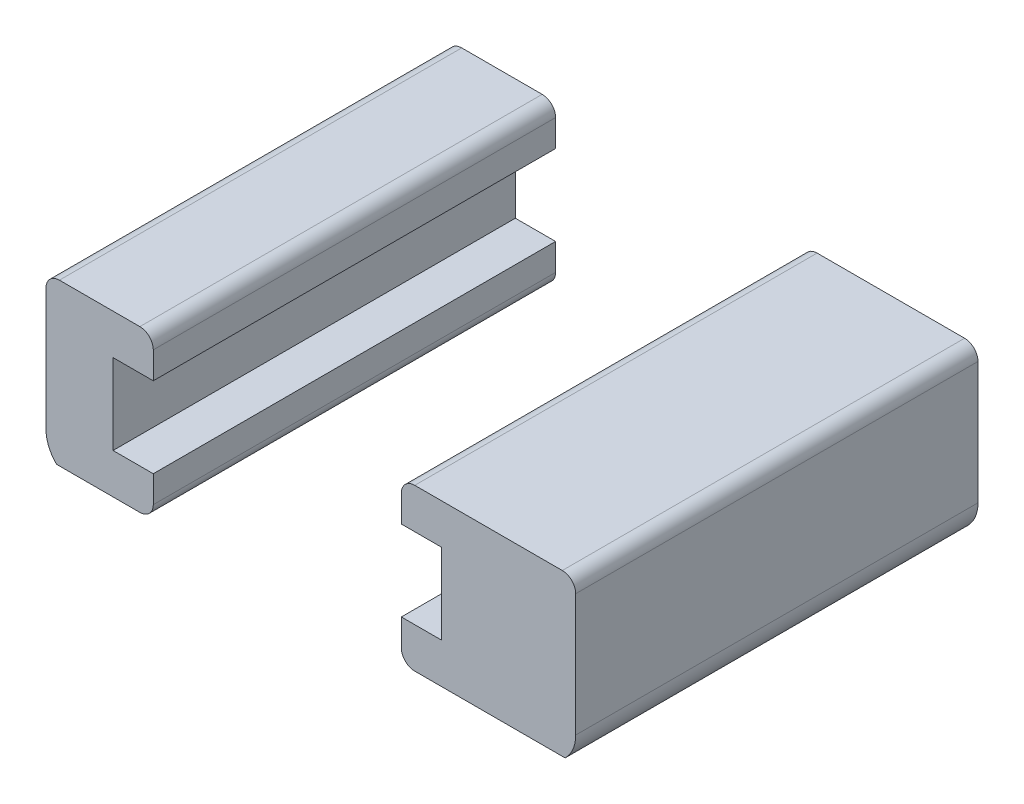
ISO-10303-21;
HEADER;
FILE_DESCRIPTION(('STEP AP214'),'2;1');
FILE_NAME('part.step','',(''),(''),'','','');
FILE_SCHEMA(('AUTOMOTIVE_DESIGN { 1 0 10303 214 1 1 1 1 }'));
ENDSEC;
DATA;
#1=APPLICATION_CONTEXT('core data for automotive mechanical design processes');
#2=APPLICATION_PROTOCOL_DEFINITION('international standard','automotive_design',2000,#1);
#3=PRODUCT_CONTEXT('',#1,'mechanical');
#4=PRODUCT('Part','Part','',(#3));
#5=PRODUCT_RELATED_PRODUCT_CATEGORY('part','',(#4));
#6=PRODUCT_DEFINITION_FORMATION('','',#4);
#7=PRODUCT_DEFINITION_CONTEXT('part definition',#1,'design');
#8=PRODUCT_DEFINITION('design','',#6,#7);
#9=PRODUCT_DEFINITION_SHAPE('','',#8);
#10=(LENGTH_UNIT() NAMED_UNIT(*) SI_UNIT(.MILLI.,.METRE.));
#11=(NAMED_UNIT(*) PLANE_ANGLE_UNIT() SI_UNIT($,.RADIAN.));
#12=(NAMED_UNIT(*) SI_UNIT($,.STERADIAN.) SOLID_ANGLE_UNIT());
#13=UNCERTAINTY_MEASURE_WITH_UNIT(LENGTH_MEASURE(1.E-05),#10,'distance_accuracy_value','');
#14=(GEOMETRIC_REPRESENTATION_CONTEXT(3) GLOBAL_UNCERTAINTY_ASSIGNED_CONTEXT((#13)) GLOBAL_UNIT_ASSIGNED_CONTEXT((#10,
#11,#12)) REPRESENTATION_CONTEXT('',''));
#15=CARTESIAN_POINT('',(0.,0.,0.));
#16=DIRECTION('',(0.,0.,1.));
#17=DIRECTION('',(1.,0.,0.));
#18=AXIS2_PLACEMENT_3D('',#15,#16,#17);
#19=CARTESIAN_POINT('',(-34.5,18.,30.));
#20=DIRECTION('',(1.,0.,0.));
#21=DIRECTION('',(0.,0.,-1.));
#22=AXIS2_PLACEMENT_3D('',#19,#20,#21);
#23=PLANE('',#22);
#24=DIRECTION('',(0.,0.,-1.));
#25=VECTOR('',#24,1.);
#26=CARTESIAN_POINT('',(-34.5000000000004,-2.25620993681813,30.));
#27=LINE('',#26,#25);
#28=CARTESIAN_POINT('',(-34.5000000000004,-2.25620993681813,30.));
#29=VERTEX_POINT('',#28);
#30=CARTESIAN_POINT('',(-34.5000000000003,-2.25620993681814,-30.));
#31=VERTEX_POINT('',#30);
#32=EDGE_CURVE('E64',#29,#31,#27,.T.);
#33=ORIENTED_EDGE('',*,*,#32,.F.);
#34=DIRECTION('',(0.,-1.,0.));
#35=VECTOR('',#34,1.);
#36=CARTESIAN_POINT('',(-34.5,18.,30.));
#37=LINE('',#36,#35);
#38=CARTESIAN_POINT('',(-34.5,16.,30.));
#39=VERTEX_POINT('',#38);
#40=EDGE_CURVE('E144',#39,#29,#37,.T.);
#41=ORIENTED_EDGE('',*,*,#40,.F.);
#42=DIRECTION('',(0.,0.,-1.));
#43=VECTOR('',#42,1.);
#44=CARTESIAN_POINT('',(-34.5,16.,30.));
#45=LINE('',#44,#43);
#46=CARTESIAN_POINT('',(-34.5,16.,-30.));
#47=VERTEX_POINT('',#46);
#48=EDGE_CURVE('E172',#39,#47,#45,.T.);
#49=ORIENTED_EDGE('',*,*,#48,.T.);
#50=DIRECTION('',(0.,-1.,0.));
#51=VECTOR('',#50,1.);
#52=CARTESIAN_POINT('',(-34.5,18.,-30.));
#53=LINE('',#52,#51);
#54=EDGE_CURVE('E147',#47,#31,#53,.T.);
#55=ORIENTED_EDGE('',*,*,#54,.T.);
#56=EDGE_LOOP('',(#33,#41,#49,#55));
#57=FACE_BOUND('',#56,.T.);
#58=ADVANCED_FACE('F49',(#57),#23,.F.);
#59=CARTESIAN_POINT('',(-24.5,0.,30.));
#60=DIRECTION('',(0.,-1.,0.));
#61=DIRECTION('',(1.,0.,0.));
#62=AXIS2_PLACEMENT_3D('',#59,#60,#61);
#63=PLANE('',#62);
#64=DIRECTION('',(-1.,0.,0.));
#65=VECTOR('',#64,1.);
#66=CARTESIAN_POINT('',(-24.5,0.,-30.));
#67=LINE('',#66,#65);
#68=CARTESIAN_POINT('',(-18.5,0.,-30.));
#69=VERTEX_POINT('',#68);
#70=CARTESIAN_POINT('',(-24.5,0.,-30.));
#71=VERTEX_POINT('',#70);
#72=EDGE_CURVE('E175',#69,#71,#67,.T.);
#73=ORIENTED_EDGE('',*,*,#72,.T.);
#74=DIRECTION('',(0.,0.,-1.));
#75=VECTOR('',#74,1.);
#76=CARTESIAN_POINT('',(-24.5,0.,30.));
#77=LINE('',#76,#75);
#78=CARTESIAN_POINT('',(-24.5,0.,30.));
#79=VERTEX_POINT('',#78);
#80=EDGE_CURVE('E138',#79,#71,#77,.T.);
#81=ORIENTED_EDGE('',*,*,#80,.F.);
#82=DIRECTION('',(-1.,0.,0.));
#83=VECTOR('',#82,1.);
#84=CARTESIAN_POINT('',(-24.5,0.,30.));
#85=LINE('',#84,#83);
#86=CARTESIAN_POINT('',(-18.5,0.,30.));
#87=VERTEX_POINT('',#86);
#88=EDGE_CURVE('E168',#87,#79,#85,.T.);
#89=ORIENTED_EDGE('',*,*,#88,.F.);
#90=DIRECTION('',(0.,0.,-1.));
#91=VECTOR('',#90,1.);
#92=CARTESIAN_POINT('',(-18.5,0.,30.));
#93=LINE('',#92,#91);
#94=EDGE_CURVE('E211',#87,#69,#93,.T.);
#95=ORIENTED_EDGE('',*,*,#94,.T.);
#96=EDGE_LOOP('',(#73,#81,#89,#95));
#97=FACE_BOUND('',#96,.T.);
#98=ADVANCED_FACE('F242',(#97),#63,.F.);
#99=CARTESIAN_POINT('',(-24.5,12.,30.));
#100=DIRECTION('',(-1.,0.,0.));
#101=DIRECTION('',(0.,-1.,0.));
#102=AXIS2_PLACEMENT_3D('',#99,#100,#101);
#103=PLANE('',#102);
#104=DIRECTION('',(0.,1.,0.));
#105=VECTOR('',#104,1.);
#106=CARTESIAN_POINT('',(-24.5,12.,-30.));
#107=LINE('',#106,#105);
#108=CARTESIAN_POINT('',(-24.5,12.,-30.));
#109=VERTEX_POINT('',#108);
#110=EDGE_CURVE('E218',#71,#109,#107,.T.);
#111=ORIENTED_EDGE('',*,*,#110,.T.);
#112=DIRECTION('',(0.,0.,-1.));
#113=VECTOR('',#112,1.);
#114=CARTESIAN_POINT('',(-24.5,12.,30.));
#115=LINE('',#114,#113);
#116=CARTESIAN_POINT('',(-24.5,12.,30.));
#117=VERTEX_POINT('',#116);
#118=EDGE_CURVE('E233',#117,#109,#115,.T.);
#119=ORIENTED_EDGE('',*,*,#118,.F.);
#120=DIRECTION('',(0.,1.,0.));
#121=VECTOR('',#120,1.);
#122=CARTESIAN_POINT('',(-24.5,12.,30.));
#123=LINE('',#122,#121);
#124=EDGE_CURVE('E166',#79,#117,#123,.T.);
#125=ORIENTED_EDGE('',*,*,#124,.F.);
#126=ORIENTED_EDGE('',*,*,#80,.T.);
#127=EDGE_LOOP('',(#111,#119,#125,#126));
#128=FACE_BOUND('',#127,.T.);
#129=ADVANCED_FACE('F245',(#128),#103,.F.);
#130=CARTESIAN_POINT('',(-24.5,12.,30.));
#131=DIRECTION('',(0.,1.,0.));
#132=DIRECTION('',(0.,0.,1.));
#133=AXIS2_PLACEMENT_3D('',#130,#131,#132);
#134=PLANE('',#133);
#135=DIRECTION('',(1.,0.,0.));
#136=VECTOR('',#135,1.);
#137=CARTESIAN_POINT('',(-24.5,12.,-30.));
#138=LINE('',#137,#136);
#139=CARTESIAN_POINT('',(-18.5,12.,-30.));
#140=VERTEX_POINT('',#139);
#141=EDGE_CURVE('E220',#109,#140,#138,.T.);
#142=ORIENTED_EDGE('',*,*,#141,.T.);
#143=DIRECTION('',(0.,0.,-1.));
#144=VECTOR('',#143,1.);
#145=CARTESIAN_POINT('',(-18.5,12.,30.));
#146=LINE('',#145,#144);
#147=CARTESIAN_POINT('',(-18.5,12.,30.));
#148=VERTEX_POINT('',#147);
#149=EDGE_CURVE('E213',#148,#140,#146,.T.);
#150=ORIENTED_EDGE('',*,*,#149,.F.);
#151=DIRECTION('',(1.,0.,0.));
#152=VECTOR('',#151,1.);
#153=CARTESIAN_POINT('',(-24.5,12.,30.));
#154=LINE('',#153,#152);
#155=EDGE_CURVE('E164',#117,#148,#154,.T.);
#156=ORIENTED_EDGE('',*,*,#155,.F.);
#157=ORIENTED_EDGE('',*,*,#118,.T.);
#158=EDGE_LOOP('',(#142,#150,#156,#157));
#159=FACE_BOUND('',#158,.T.);
#160=ADVANCED_FACE('F249',(#159),#134,.F.);
#161=CARTESIAN_POINT('',(-18.5,18.,30.));
#162=DIRECTION('',(-1.,0.,0.));
#163=DIRECTION('',(0.,0.,1.));
#164=AXIS2_PLACEMENT_3D('',#161,#162,#163);
#165=PLANE('',#164);
#166=DIRECTION('',(0.,1.,0.));
#167=VECTOR('',#166,1.);
#168=CARTESIAN_POINT('',(-18.5,18.,-30.));
#169=LINE('',#168,#167);
#170=CARTESIAN_POINT('',(-18.5,16.,-30.));
#171=VERTEX_POINT('',#170);
#172=EDGE_CURVE('E222',#140,#171,#169,.T.);
#173=ORIENTED_EDGE('',*,*,#172,.T.);
#174=DIRECTION('',(0.,0.,-1.));
#175=VECTOR('',#174,1.);
#176=CARTESIAN_POINT('',(-18.5,16.,30.));
#177=LINE('',#176,#175);
#178=CARTESIAN_POINT('',(-18.5,16.,30.));
#179=VERTEX_POINT('',#178);
#180=EDGE_CURVE('E192',#171,#179,#177,.F.);
#181=ORIENTED_EDGE('',*,*,#180,.T.);
#182=DIRECTION('',(0.,1.,0.));
#183=VECTOR('',#182,1.);
#184=CARTESIAN_POINT('',(-18.5,18.,30.));
#185=LINE('',#184,#183);
#186=EDGE_CURVE('E156',#148,#179,#185,.T.);
#187=ORIENTED_EDGE('',*,*,#186,.F.);
#188=ORIENTED_EDGE('',*,*,#149,.T.);
#189=EDGE_LOOP('',(#173,#181,#187,#188));
#190=FACE_BOUND('',#189,.T.);
#191=ADVANCED_FACE('F253',(#190),#165,.F.);
#192=CARTESIAN_POINT('',(-34.5,18.,30.));
#193=DIRECTION('',(0.,-1.,0.));
#194=DIRECTION('',(0.,0.,-1.));
#195=AXIS2_PLACEMENT_3D('',#192,#193,#194);
#196=PLANE('',#195);
#197=DIRECTION('',(-1.,0.,0.));
#198=VECTOR('',#197,1.);
#199=CARTESIAN_POINT('',(-34.5,18.,-30.));
#200=LINE('',#199,#198);
#201=CARTESIAN_POINT('',(-20.5,18.,-30.));
#202=VERTEX_POINT('',#201);
#203=CARTESIAN_POINT('',(-32.5,18.,-30.));
#204=VERTEX_POINT('',#203);
#205=EDGE_CURVE('E225',#202,#204,#200,.T.);
#206=ORIENTED_EDGE('',*,*,#205,.T.);
#207=DIRECTION('',(0.,0.,-1.));
#208=VECTOR('',#207,1.);
#209=CARTESIAN_POINT('',(-32.5,18.,30.));
#210=LINE('',#209,#208);
#211=CARTESIAN_POINT('',(-32.5,18.,30.));
#212=VERTEX_POINT('',#211);
#213=EDGE_CURVE('E185',#204,#212,#210,.F.);
#214=ORIENTED_EDGE('',*,*,#213,.T.);
#215=DIRECTION('',(-1.,0.,0.));
#216=VECTOR('',#215,1.);
#217=CARTESIAN_POINT('',(-34.5,18.,30.));
#218=LINE('',#217,#216);
#219=CARTESIAN_POINT('',(-20.5,18.,30.));
#220=VERTEX_POINT('',#219);
#221=EDGE_CURVE('E153',#220,#212,#218,.T.);
#222=ORIENTED_EDGE('',*,*,#221,.F.);
#223=DIRECTION('',(0.,0.,-1.));
#224=VECTOR('',#223,1.);
#225=CARTESIAN_POINT('',(-20.5,18.,30.));
#226=LINE('',#225,#224);
#227=EDGE_CURVE('E182',#220,#202,#226,.T.);
#228=ORIENTED_EDGE('',*,*,#227,.T.);
#229=EDGE_LOOP('',(#206,#214,#222,#228));
#230=FACE_BOUND('',#229,.T.);
#231=ADVANCED_FACE('F257',(#230),#196,.F.);
#232=CARTESIAN_POINT('',(-34.5,-6.,30.));
#233=DIRECTION('',(0.,1.,0.));
#234=DIRECTION('',(-1.,0.,0.));
#235=AXIS2_PLACEMENT_3D('',#232,#233,#234);
#236=PLANE('',#235);
#237=DIRECTION('',(1.,0.,0.));
#238=VECTOR('',#237,1.);
#239=CARTESIAN_POINT('',(-34.5,-6.,30.));
#240=LINE('',#239,#238);
#241=CARTESIAN_POINT('',(-32.9199862130751,-6.00000000000004,30.));
#242=VERTEX_POINT('',#241);
#243=CARTESIAN_POINT('',(-20.5,-6.,30.));
#244=VERTEX_POINT('',#243);
#245=EDGE_CURVE('E154',#242,#244,#240,.T.);
#246=ORIENTED_EDGE('',*,*,#245,.F.);
#247=DIRECTION('',(0.,0.,-1.));
#248=VECTOR('',#247,1.);
#249=CARTESIAN_POINT('',(-32.9199862130751,-6.00000000000004,30.));
#250=LINE('',#249,#248);
#251=CARTESIAN_POINT('',(-32.9199862130751,-6.00000000000001,-30.));
#252=VERTEX_POINT('',#251);
#253=EDGE_CURVE('E134',#242,#252,#250,.T.);
#254=ORIENTED_EDGE('',*,*,#253,.T.);
#255=DIRECTION('',(1.,0.,0.));
#256=VECTOR('',#255,1.);
#257=CARTESIAN_POINT('',(-34.5,-6.,-30.));
#258=LINE('',#257,#256);
#259=CARTESIAN_POINT('',(-20.5,-6.,-30.));
#260=VERTEX_POINT('',#259);
#261=EDGE_CURVE('E202',#252,#260,#258,.T.);
#262=ORIENTED_EDGE('',*,*,#261,.T.);
#263=DIRECTION('',(0.,0.,-1.));
#264=VECTOR('',#263,1.);
#265=CARTESIAN_POINT('',(-20.5,-6.,30.));
#266=LINE('',#265,#264);
#267=EDGE_CURVE('E58',#260,#244,#266,.F.);
#268=ORIENTED_EDGE('',*,*,#267,.T.);
#269=EDGE_LOOP('',(#246,#254,#262,#268));
#270=FACE_BOUND('',#269,.T.);
#271=ADVANCED_FACE('F200',(#270),#236,.F.);
#272=CARTESIAN_POINT('',(-18.5,0.,30.));
#273=DIRECTION('',(-1.,0.,0.));
#274=DIRECTION('',(0.,-1.,0.));
#275=AXIS2_PLACEMENT_3D('',#272,#273,#274);
#276=PLANE('',#275);
#277=DIRECTION('',(0.,1.,0.));
#278=VECTOR('',#277,1.);
#279=CARTESIAN_POINT('',(-18.5,0.,30.));
#280=LINE('',#279,#278);
#281=CARTESIAN_POINT('',(-18.5,-4.,30.));
#282=VERTEX_POINT('',#281);
#283=EDGE_CURVE('E158',#282,#87,#280,.T.);
#284=ORIENTED_EDGE('',*,*,#283,.F.);
#285=DIRECTION('',(0.,0.,-1.));
#286=VECTOR('',#285,1.);
#287=CARTESIAN_POINT('',(-18.5,-4.,30.));
#288=LINE('',#287,#286);
#289=CARTESIAN_POINT('',(-18.5,-4.,-30.));
#290=VERTEX_POINT('',#289);
#291=EDGE_CURVE('E194',#282,#290,#288,.T.);
#292=ORIENTED_EDGE('',*,*,#291,.T.);
#293=DIRECTION('',(0.,1.,0.));
#294=VECTOR('',#293,1.);
#295=CARTESIAN_POINT('',(-18.5,0.,-30.));
#296=LINE('',#295,#294);
#297=EDGE_CURVE('E171',#290,#69,#296,.T.);
#298=ORIENTED_EDGE('',*,*,#297,.T.);
#299=ORIENTED_EDGE('',*,*,#94,.F.);
#300=EDGE_LOOP('',(#284,#292,#298,#299));
#301=FACE_BOUND('',#300,.T.);
#302=ADVANCED_FACE('F208',(#301),#276,.F.);
#303=CARTESIAN_POINT('',(0.,0.,30.));
#304=DIRECTION('',(0.,0.,-1.));
#305=DIRECTION('',(-1.,0.,0.));
#306=AXIS2_PLACEMENT_3D('',#303,#304,#305);
#307=PLANE('',#306);
#308=ORIENTED_EDGE('',*,*,#40,.T.);
#309=CARTESIAN_POINT('',(-29.5000000000004,-2.25620993681814,30.));
#310=DIRECTION('',(0.,0.,1.));
#311=DIRECTION('',(0.,1.,0.));
#312=AXIS2_PLACEMENT_3D('',#309,#310,#311);
#313=ELLIPSE('',#312,5.13210298990152,5.);
#314=EDGE_CURVE('E131',#29,#242,#313,.T.);
#315=ORIENTED_EDGE('',*,*,#314,.T.);
#316=ORIENTED_EDGE('',*,*,#245,.T.);
#317=CARTESIAN_POINT('',(-20.5,-4.,30.));
#318=DIRECTION('',(0.,0.,-1.));
#319=DIRECTION('',(-1.,0.,0.));
#320=AXIS2_PLACEMENT_3D('',#317,#318,#319);
#321=CIRCLE('',#320,2.);
#322=EDGE_CURVE('E187',#244,#282,#321,.F.);
#323=ORIENTED_EDGE('',*,*,#322,.T.);
#324=ORIENTED_EDGE('',*,*,#283,.T.);
#325=ORIENTED_EDGE('',*,*,#88,.T.);
#326=ORIENTED_EDGE('',*,*,#124,.T.);
#327=ORIENTED_EDGE('',*,*,#155,.T.);
#328=ORIENTED_EDGE('',*,*,#186,.T.);
#329=CARTESIAN_POINT('',(-20.5,16.,30.));
#330=DIRECTION('',(0.,0.,-1.));
#331=DIRECTION('',(-1.,0.,0.));
#332=AXIS2_PLACEMENT_3D('',#329,#330,#331);
#333=CIRCLE('',#332,2.);
#334=EDGE_CURVE('E189',#179,#220,#333,.F.);
#335=ORIENTED_EDGE('',*,*,#334,.T.);
#336=ORIENTED_EDGE('',*,*,#221,.T.);
#337=CARTESIAN_POINT('',(-32.5,16.,30.));
#338=DIRECTION('',(0.,0.,-1.));
#339=DIRECTION('',(-1.,0.,0.));
#340=AXIS2_PLACEMENT_3D('',#337,#338,#339);
#341=CIRCLE('',#340,2.);
#342=EDGE_CURVE('E152',#212,#39,#341,.F.);
#343=ORIENTED_EDGE('',*,*,#342,.T.);
#344=EDGE_LOOP('',(#308,#315,#316,#323,#324,#325,#326,#327,#328,#335,#336,#343));
#345=FACE_BOUND('',#344,.T.);
#346=ADVANCED_FACE('F149',(#345),#307,.F.);
#347=CARTESIAN_POINT('',(0.,0.,-30.));
#348=DIRECTION('',(0.,0.,-1.));
#349=DIRECTION('',(-1.,0.,0.));
#350=AXIS2_PLACEMENT_3D('',#347,#348,#349);
#351=PLANE('',#350);
#352=CARTESIAN_POINT('',(-29.5000000000004,-2.25620993681814,-30.));
#353=DIRECTION('',(0.,0.,-1.));
#354=DIRECTION('',(0.,1.,0.));
#355=AXIS2_PLACEMENT_3D('',#352,#353,#354);
#356=ELLIPSE('',#355,5.13210298990152,5.);
#357=EDGE_CURVE('E12',#31,#252,#356,.F.);
#358=ORIENTED_EDGE('',*,*,#357,.F.);
#359=ORIENTED_EDGE('',*,*,#54,.F.);
#360=CARTESIAN_POINT('',(-32.5,16.,-30.));
#361=DIRECTION('',(0.,0.,-1.));
#362=DIRECTION('',(-1.,0.,0.));
#363=AXIS2_PLACEMENT_3D('',#360,#361,#362);
#364=CIRCLE('',#363,2.);
#365=EDGE_CURVE('E180',#47,#204,#364,.T.);
#366=ORIENTED_EDGE('',*,*,#365,.T.);
#367=ORIENTED_EDGE('',*,*,#205,.F.);
#368=CARTESIAN_POINT('',(-20.5,16.,-30.));
#369=DIRECTION('',(0.,0.,-1.));
#370=DIRECTION('',(-1.,0.,0.));
#371=AXIS2_PLACEMENT_3D('',#368,#369,#370);
#372=CIRCLE('',#371,2.);
#373=EDGE_CURVE('E178',#202,#171,#372,.T.);
#374=ORIENTED_EDGE('',*,*,#373,.T.);
#375=ORIENTED_EDGE('',*,*,#172,.F.);
#376=ORIENTED_EDGE('',*,*,#141,.F.);
#377=ORIENTED_EDGE('',*,*,#110,.F.);
#378=ORIENTED_EDGE('',*,*,#72,.F.);
#379=ORIENTED_EDGE('',*,*,#297,.F.);
#380=CARTESIAN_POINT('',(-20.5,-4.,-30.));
#381=DIRECTION('',(0.,0.,-1.));
#382=DIRECTION('',(-1.,0.,0.));
#383=AXIS2_PLACEMENT_3D('',#380,#381,#382);
#384=CIRCLE('',#383,2.);
#385=EDGE_CURVE('E174',#290,#260,#384,.T.);
#386=ORIENTED_EDGE('',*,*,#385,.T.);
#387=ORIENTED_EDGE('',*,*,#261,.F.);
#388=EDGE_LOOP('',(#358,#359,#366,#367,#374,#375,#376,#377,#378,#379,#386,#387));
#389=FACE_BOUND('',#388,.T.);
#390=ADVANCED_FACE('F268',(#389),#351,.T.);
#391=CARTESIAN_POINT('',(-32.5,16.,30.));
#392=DIRECTION('',(0.,0.,-1.));
#393=DIRECTION('',(-1.,0.,0.));
#394=AXIS2_PLACEMENT_3D('',#391,#392,#393);
#395=CYLINDRICAL_SURFACE('',#394,2.);
#396=ORIENTED_EDGE('',*,*,#342,.F.);
#397=ORIENTED_EDGE('',*,*,#213,.F.);
#398=ORIENTED_EDGE('',*,*,#365,.F.);
#399=ORIENTED_EDGE('',*,*,#48,.F.);
#400=EDGE_LOOP('',(#396,#397,#398,#399));
#401=FACE_BOUND('',#400,.T.);
#402=ADVANCED_FACE('F271',(#401),#395,.T.);
#403=CARTESIAN_POINT('',(-20.5,16.,30.));
#404=DIRECTION('',(0.,0.,-1.));
#405=DIRECTION('',(-1.,0.,0.));
#406=AXIS2_PLACEMENT_3D('',#403,#404,#405);
#407=CYLINDRICAL_SURFACE('',#406,2.);
#408=ORIENTED_EDGE('',*,*,#334,.F.);
#409=ORIENTED_EDGE('',*,*,#180,.F.);
#410=ORIENTED_EDGE('',*,*,#373,.F.);
#411=ORIENTED_EDGE('',*,*,#227,.F.);
#412=EDGE_LOOP('',(#408,#409,#410,#411));
#413=FACE_BOUND('',#412,.T.);
#414=ADVANCED_FACE('F276',(#413),#407,.T.);
#415=CARTESIAN_POINT('',(-20.5,-4.,30.));
#416=DIRECTION('',(0.,0.,-1.));
#417=DIRECTION('',(-1.,0.,0.));
#418=AXIS2_PLACEMENT_3D('',#415,#416,#417);
#419=CYLINDRICAL_SURFACE('',#418,2.);
#420=ORIENTED_EDGE('',*,*,#322,.F.);
#421=ORIENTED_EDGE('',*,*,#267,.F.);
#422=ORIENTED_EDGE('',*,*,#385,.F.);
#423=ORIENTED_EDGE('',*,*,#291,.F.);
#424=EDGE_LOOP('',(#420,#421,#422,#423));
#425=FACE_BOUND('',#424,.T.);
#426=ADVANCED_FACE('F51',(#425),#419,.T.);
#427=DIRECTION('',(0.,0.,-1.));
#428=VECTOR('',#427,1.);
#429=SURFACE_OF_LINEAR_EXTRUSION('',#313,#428);
#430=ORIENTED_EDGE('',*,*,#357,.T.);
#431=ORIENTED_EDGE('',*,*,#253,.F.);
#432=ORIENTED_EDGE('',*,*,#314,.F.);
#433=ORIENTED_EDGE('',*,*,#32,.T.);
#434=EDGE_LOOP('',(#430,#431,#432,#433));
#435=FACE_BOUND('',#434,.T.);
#436=ADVANCED_FACE('F132',(#435),#429,.F.);
#437=CLOSED_SHELL('',(#58,#98,#129,#160,#191,#231,#271,#302,#346,#390,#402,#414,#426,#436));
#438=MANIFOLD_SOLID_BREP('B2',#437);
#439=CARTESIAN_POINT('',(18.5,18.,30.));
#440=DIRECTION('',(1.,0.,0.));
#441=DIRECTION('',(0.,0.,-1.));
#442=AXIS2_PLACEMENT_3D('',#439,#440,#441);
#443=PLANE('',#442);
#444=DIRECTION('',(0.,-1.,0.));
#445=VECTOR('',#444,1.);
#446=CARTESIAN_POINT('',(18.5,18.,30.));
#447=LINE('',#446,#445);
#448=CARTESIAN_POINT('',(18.5,16.,30.));
#449=VERTEX_POINT('',#448);
#450=CARTESIAN_POINT('',(18.5,12.,30.));
#451=VERTEX_POINT('',#450);
#452=EDGE_CURVE('E516',#449,#451,#447,.T.);
#453=ORIENTED_EDGE('',*,*,#452,.F.);
#454=DIRECTION('',(0.,0.,-1.));
#455=VECTOR('',#454,1.);
#456=CARTESIAN_POINT('',(18.5,16.,30.));
#457=LINE('',#456,#455);
#458=CARTESIAN_POINT('',(18.5,16.,-30.));
#459=VERTEX_POINT('',#458);
#460=EDGE_CURVE('E553',#449,#459,#457,.T.);
#461=ORIENTED_EDGE('',*,*,#460,.T.);
#462=DIRECTION('',(0.,-1.,0.));
#463=VECTOR('',#462,1.);
#464=CARTESIAN_POINT('',(18.5,18.,-30.));
#465=LINE('',#464,#463);
#466=CARTESIAN_POINT('',(18.5,12.,-30.));
#467=VERTEX_POINT('',#466);
#468=EDGE_CURVE('E589',#459,#467,#465,.T.);
#469=ORIENTED_EDGE('',*,*,#468,.T.);
#470=DIRECTION('',(0.,0.,-1.));
#471=VECTOR('',#470,1.);
#472=CARTESIAN_POINT('',(18.5,12.,30.));
#473=LINE('',#472,#471);
#474=EDGE_CURVE('E532',#451,#467,#473,.T.);
#475=ORIENTED_EDGE('',*,*,#474,.F.);
#476=EDGE_LOOP('',(#453,#461,#469,#475));
#477=FACE_BOUND('',#476,.T.);
#478=ADVANCED_FACE('F410',(#477),#443,.F.);
#479=CARTESIAN_POINT('',(24.5,12.,30.));
#480=DIRECTION('',(0.,1.,0.));
#481=DIRECTION('',(-1.,0.,0.));
#482=AXIS2_PLACEMENT_3D('',#479,#480,#481);
#483=PLANE('',#482);
#484=DIRECTION('',(1.,0.,0.));
#485=VECTOR('',#484,1.);
#486=CARTESIAN_POINT('',(24.5,12.,-30.));
#487=LINE('',#486,#485);
#488=CARTESIAN_POINT('',(24.5,12.,-30.));
#489=VERTEX_POINT('',#488);
#490=EDGE_CURVE('E587',#467,#489,#487,.T.);
#491=ORIENTED_EDGE('',*,*,#490,.T.);
#492=DIRECTION('',(0.,0.,-1.));
#493=VECTOR('',#492,1.);
#494=CARTESIAN_POINT('',(24.5,12.,30.));
#495=LINE('',#494,#493);
#496=CARTESIAN_POINT('',(24.5,12.,30.));
#497=VERTEX_POINT('',#496);
#498=EDGE_CURVE('E529',#497,#489,#495,.T.);
#499=ORIENTED_EDGE('',*,*,#498,.F.);
#500=DIRECTION('',(1.,0.,0.));
#501=VECTOR('',#500,1.);
#502=CARTESIAN_POINT('',(24.5,12.,30.));
#503=LINE('',#502,#501);
#504=EDGE_CURVE('E598',#451,#497,#503,.T.);
#505=ORIENTED_EDGE('',*,*,#504,.F.);
#506=ORIENTED_EDGE('',*,*,#474,.T.);
#507=EDGE_LOOP('',(#491,#499,#505,#506));
#508=FACE_BOUND('',#507,.T.);
#509=ADVANCED_FACE('F628',(#508),#483,.F.);
#510=CARTESIAN_POINT('',(24.5,12.,30.));
#511=DIRECTION('',(1.,0.,0.));
#512=DIRECTION('',(0.,0.,-1.));
#513=AXIS2_PLACEMENT_3D('',#510,#511,#512);
#514=PLANE('',#513);
#515=DIRECTION('',(0.,-1.,0.));
#516=VECTOR('',#515,1.);
#517=CARTESIAN_POINT('',(24.5,12.,-30.));
#518=LINE('',#517,#516);
#519=CARTESIAN_POINT('',(24.5,0.,-30.));
#520=VERTEX_POINT('',#519);
#521=EDGE_CURVE('E583',#489,#520,#518,.T.);
#522=ORIENTED_EDGE('',*,*,#521,.T.);
#523=DIRECTION('',(0.,0.,-1.));
#524=VECTOR('',#523,1.);
#525=CARTESIAN_POINT('',(24.5,0.,30.));
#526=LINE('',#525,#524);
#527=CARTESIAN_POINT('',(24.5,0.,30.));
#528=VERTEX_POINT('',#527);
#529=EDGE_CURVE('E525',#528,#520,#526,.T.);
#530=ORIENTED_EDGE('',*,*,#529,.F.);
#531=DIRECTION('',(0.,-1.,0.));
#532=VECTOR('',#531,1.);
#533=CARTESIAN_POINT('',(24.5,12.,30.));
#534=LINE('',#533,#532);
#535=EDGE_CURVE('E596',#497,#528,#534,.T.);
#536=ORIENTED_EDGE('',*,*,#535,.F.);
#537=ORIENTED_EDGE('',*,*,#498,.T.);
#538=EDGE_LOOP('',(#522,#530,#536,#537));
#539=FACE_BOUND('',#538,.T.);
#540=ADVANCED_FACE('F624',(#539),#514,.F.);
#541=CARTESIAN_POINT('',(18.5,0.,30.));
#542=DIRECTION('',(0.,-1.,0.));
#543=DIRECTION('',(1.,0.,0.));
#544=AXIS2_PLACEMENT_3D('',#541,#542,#543);
#545=PLANE('',#544);
#546=DIRECTION('',(-1.,0.,0.));
#547=VECTOR('',#546,1.);
#548=CARTESIAN_POINT('',(18.5,0.,-30.));
#549=LINE('',#548,#547);
#550=CARTESIAN_POINT('',(18.5,0.,-30.));
#551=VERTEX_POINT('',#550);
#552=EDGE_CURVE('E582',#520,#551,#549,.T.);
#553=ORIENTED_EDGE('',*,*,#552,.T.);
#554=DIRECTION('',(0.,0.,-1.));
#555=VECTOR('',#554,1.);
#556=CARTESIAN_POINT('',(18.5,0.,30.));
#557=LINE('',#556,#555);
#558=CARTESIAN_POINT('',(18.5,0.,30.));
#559=VERTEX_POINT('',#558);
#560=EDGE_CURVE('E522',#559,#551,#557,.T.);
#561=ORIENTED_EDGE('',*,*,#560,.F.);
#562=DIRECTION('',(-1.,0.,0.));
#563=VECTOR('',#562,1.);
#564=CARTESIAN_POINT('',(18.5,0.,30.));
#565=LINE('',#564,#563);
#566=EDGE_CURVE('E573',#528,#559,#565,.T.);
#567=ORIENTED_EDGE('',*,*,#566,.F.);
#568=ORIENTED_EDGE('',*,*,#529,.T.);
#569=EDGE_LOOP('',(#553,#561,#567,#568));
#570=FACE_BOUND('',#569,.T.);
#571=ADVANCED_FACE('F621',(#570),#545,.F.);
#572=CARTESIAN_POINT('',(18.5,0.,30.));
#573=DIRECTION('',(1.,0.,0.));
#574=DIRECTION('',(0.,1.,0.));
#575=AXIS2_PLACEMENT_3D('',#572,#573,#574);
#576=PLANE('',#575);
#577=DIRECTION('',(0.,-1.,0.));
#578=VECTOR('',#577,1.);
#579=CARTESIAN_POINT('',(18.5,0.,-30.));
#580=LINE('',#579,#578);
#581=CARTESIAN_POINT('',(18.5,-3.99999999999999,-30.));
#582=VERTEX_POINT('',#581);
#583=EDGE_CURVE('E518',#551,#582,#580,.T.);
#584=ORIENTED_EDGE('',*,*,#583,.T.);
#585=DIRECTION('',(0.,0.,-1.));
#586=VECTOR('',#585,1.);
#587=CARTESIAN_POINT('',(18.5,-3.99999999999999,30.));
#588=LINE('',#587,#586);
#589=CARTESIAN_POINT('',(18.5,-3.99999999999999,30.));
#590=VERTEX_POINT('',#589);
#591=EDGE_CURVE('E419',#582,#590,#588,.F.);
#592=ORIENTED_EDGE('',*,*,#591,.T.);
#593=DIRECTION('',(0.,-1.,0.));
#594=VECTOR('',#593,1.);
#595=CARTESIAN_POINT('',(18.5,0.,30.));
#596=LINE('',#595,#594);
#597=EDGE_CURVE('E564',#559,#590,#596,.T.);
#598=ORIENTED_EDGE('',*,*,#597,.F.);
#599=ORIENTED_EDGE('',*,*,#560,.T.);
#600=EDGE_LOOP('',(#584,#592,#598,#599));
#601=FACE_BOUND('',#600,.T.);
#602=ADVANCED_FACE('F563',(#601),#576,.F.);
#603=CARTESIAN_POINT('',(18.5,-5.99999999999999,30.));
#604=DIRECTION('',(0.,1.,0.));
#605=DIRECTION('',(-1.,0.,0.));
#606=AXIS2_PLACEMENT_3D('',#603,#604,#605);
#607=PLANE('',#606);
#608=DIRECTION('',(1.,0.,0.));
#609=VECTOR('',#608,1.);
#610=CARTESIAN_POINT('',(18.5,-5.99999999999999,-30.));
#611=LINE('',#610,#609);
#612=CARTESIAN_POINT('',(20.5,-5.99999999999999,-30.));
#613=VERTEX_POINT('',#612);
#614=CARTESIAN_POINT('',(42.9199862130685,-5.9999999999939,-30.));
#615=VERTEX_POINT('',#614);
#616=EDGE_CURVE('E513',#613,#615,#611,.T.);
#617=ORIENTED_EDGE('',*,*,#616,.T.);
#618=DIRECTION('',(0.,0.,-1.));
#619=VECTOR('',#618,1.);
#620=CARTESIAN_POINT('',(42.9199862130748,-5.99999999998781,30.));
#621=LINE('',#620,#619);
#622=CARTESIAN_POINT('',(42.9199862130748,-5.99999999998781,30.));
#623=VERTEX_POINT('',#622);
#624=EDGE_CURVE('E425',#623,#615,#621,.T.);
#625=ORIENTED_EDGE('',*,*,#624,.F.);
#626=DIRECTION('',(1.,0.,0.));
#627=VECTOR('',#626,1.);
#628=CARTESIAN_POINT('',(18.5,-5.99999999999999,30.));
#629=LINE('',#628,#627);
#630=CARTESIAN_POINT('',(20.5,-5.99999999999999,30.));
#631=VERTEX_POINT('',#630);
#632=EDGE_CURVE('E575',#631,#623,#629,.T.);
#633=ORIENTED_EDGE('',*,*,#632,.F.);
#634=DIRECTION('',(0.,0.,-1.));
#635=VECTOR('',#634,1.);
#636=CARTESIAN_POINT('',(20.5,-5.99999999999999,30.));
#637=LINE('',#636,#635);
#638=EDGE_CURVE('E556',#631,#613,#637,.T.);
#639=ORIENTED_EDGE('',*,*,#638,.T.);
#640=EDGE_LOOP('',(#617,#625,#633,#639));
#641=FACE_BOUND('',#640,.T.);
#642=ADVANCED_FACE('F579',(#641),#607,.F.);
#643=CARTESIAN_POINT('',(44.5,18.,30.));
#644=DIRECTION('',(-1.,0.,0.));
#645=DIRECTION('',(0.,-1.,0.));
#646=AXIS2_PLACEMENT_3D('',#643,#644,#645);
#647=PLANE('',#646);
#648=DIRECTION('',(0.,1.,0.));
#649=VECTOR('',#648,1.);
#650=CARTESIAN_POINT('',(44.5,18.,30.));
#651=LINE('',#650,#649);
#652=CARTESIAN_POINT('',(44.5,-2.25620993680593,30.));
#653=VERTEX_POINT('',#652);
#654=CARTESIAN_POINT('',(44.5,16.,30.));
#655=VERTEX_POINT('',#654);
#656=EDGE_CURVE('E505',#653,#655,#651,.T.);
#657=ORIENTED_EDGE('',*,*,#656,.F.);
#658=DIRECTION('',(0.,0.,-1.));
#659=VECTOR('',#658,1.);
#660=CARTESIAN_POINT('',(44.5,-2.25620993680593,30.));
#661=LINE('',#660,#659);
#662=CARTESIAN_POINT('',(44.5,-2.25620993680593,-30.));
#663=VERTEX_POINT('',#662);
#664=EDGE_CURVE('E492',#653,#663,#661,.T.);
#665=ORIENTED_EDGE('',*,*,#664,.T.);
#666=DIRECTION('',(0.,1.,0.));
#667=VECTOR('',#666,1.);
#668=CARTESIAN_POINT('',(44.5,18.,-30.));
#669=LINE('',#668,#667);
#670=CARTESIAN_POINT('',(44.5,16.,-30.));
#671=VERTEX_POINT('',#670);
#672=EDGE_CURVE('E503',#663,#671,#669,.T.);
#673=ORIENTED_EDGE('',*,*,#672,.T.);
#674=DIRECTION('',(0.,0.,-1.));
#675=VECTOR('',#674,1.);
#676=CARTESIAN_POINT('',(44.5,16.,30.));
#677=LINE('',#676,#675);
#678=EDGE_CURVE('E545',#671,#655,#677,.F.);
#679=ORIENTED_EDGE('',*,*,#678,.T.);
#680=EDGE_LOOP('',(#657,#665,#673,#679));
#681=FACE_BOUND('',#680,.T.);
#682=ADVANCED_FACE('F501',(#681),#647,.F.);
#683=CARTESIAN_POINT('',(18.5,18.,30.));
#684=DIRECTION('',(0.,-1.,0.));
#685=DIRECTION('',(1.,0.,0.));
#686=AXIS2_PLACEMENT_3D('',#683,#684,#685);
#687=PLANE('',#686);
#688=DIRECTION('',(-1.,0.,0.));
#689=VECTOR('',#688,1.);
#690=CARTESIAN_POINT('',(18.5,18.,30.));
#691=LINE('',#690,#689);
#692=CARTESIAN_POINT('',(42.5,18.,30.));
#693=VERTEX_POINT('',#692);
#694=CARTESIAN_POINT('',(20.5,18.,30.));
#695=VERTEX_POINT('',#694);
#696=EDGE_CURVE('E526',#693,#695,#691,.T.);
#697=ORIENTED_EDGE('',*,*,#696,.F.);
#698=DIRECTION('',(0.,0.,-1.));
#699=VECTOR('',#698,1.);
#700=CARTESIAN_POINT('',(42.5,18.,30.));
#701=LINE('',#700,#699);
#702=CARTESIAN_POINT('',(42.5,18.,-30.));
#703=VERTEX_POINT('',#702);
#704=EDGE_CURVE('E537',#693,#703,#701,.T.);
#705=ORIENTED_EDGE('',*,*,#704,.T.);
#706=DIRECTION('',(-1.,0.,0.));
#707=VECTOR('',#706,1.);
#708=CARTESIAN_POINT('',(18.5,18.,-30.));
#709=LINE('',#708,#707);
#710=CARTESIAN_POINT('',(20.5,18.,-30.));
#711=VERTEX_POINT('',#710);
#712=EDGE_CURVE('E512',#703,#711,#709,.T.);
#713=ORIENTED_EDGE('',*,*,#712,.T.);
#714=DIRECTION('',(0.,0.,-1.));
#715=VECTOR('',#714,1.);
#716=CARTESIAN_POINT('',(20.5,18.,30.));
#717=LINE('',#716,#715);
#718=EDGE_CURVE('E535',#711,#695,#717,.F.);
#719=ORIENTED_EDGE('',*,*,#718,.T.);
#720=EDGE_LOOP('',(#697,#705,#713,#719));
#721=FACE_BOUND('',#720,.T.);
#722=ADVANCED_FACE('F608',(#721),#687,.F.);
#723=CARTESIAN_POINT('',(0.,0.,30.));
#724=DIRECTION('',(0.,0.,-1.));
#725=DIRECTION('',(-1.,0.,0.));
#726=AXIS2_PLACEMENT_3D('',#723,#724,#725);
#727=PLANE('',#726);
#728=ORIENTED_EDGE('',*,*,#632,.T.);
#729=CARTESIAN_POINT('',(39.5,-2.25620993680592,30.));
#730=DIRECTION('',(0.,0.,1.));
#731=DIRECTION('',(0.,-1.,0.));
#732=AXIS2_PLACEMENT_3D('',#729,#730,#731);
#733=ELLIPSE('',#732,5.13210298990152,5.);
#734=EDGE_CURVE('E506',#623,#653,#733,.T.);
#735=ORIENTED_EDGE('',*,*,#734,.T.);
#736=ORIENTED_EDGE('',*,*,#656,.T.);
#737=CARTESIAN_POINT('',(42.5,16.,30.));
#738=DIRECTION('',(0.,0.,-1.));
#739=DIRECTION('',(-1.,0.,0.));
#740=AXIS2_PLACEMENT_3D('',#737,#738,#739);
#741=CIRCLE('',#740,2.);
#742=EDGE_CURVE('E551',#655,#693,#741,.F.);
#743=ORIENTED_EDGE('',*,*,#742,.T.);
#744=ORIENTED_EDGE('',*,*,#696,.T.);
#745=CARTESIAN_POINT('',(20.5,16.,30.));
#746=DIRECTION('',(0.,0.,-1.));
#747=DIRECTION('',(-1.,0.,0.));
#748=AXIS2_PLACEMENT_3D('',#745,#746,#747);
#749=CIRCLE('',#748,2.);
#750=EDGE_CURVE('E549',#695,#449,#749,.F.);
#751=ORIENTED_EDGE('',*,*,#750,.T.);
#752=ORIENTED_EDGE('',*,*,#452,.T.);
#753=ORIENTED_EDGE('',*,*,#504,.T.);
#754=ORIENTED_EDGE('',*,*,#535,.T.);
#755=ORIENTED_EDGE('',*,*,#566,.T.);
#756=ORIENTED_EDGE('',*,*,#597,.T.);
#757=CARTESIAN_POINT('',(20.5,-3.99999999999999,30.));
#758=DIRECTION('',(0.,0.,-1.));
#759=DIRECTION('',(-1.,0.,0.));
#760=AXIS2_PLACEMENT_3D('',#757,#758,#759);
#761=CIRCLE('',#760,2.);
#762=EDGE_CURVE('E547',#590,#631,#761,.F.);
#763=ORIENTED_EDGE('',*,*,#762,.T.);
#764=EDGE_LOOP('',(#728,#735,#736,#743,#744,#751,#752,#753,#754,#755,#756,#763));
#765=FACE_BOUND('',#764,.T.);
#766=ADVANCED_FACE('F570',(#765),#727,.F.);
#767=CARTESIAN_POINT('',(0.,0.,-30.));
#768=DIRECTION('',(0.,0.,-1.));
#769=DIRECTION('',(-1.,0.,0.));
#770=AXIS2_PLACEMENT_3D('',#767,#768,#769);
#771=PLANE('',#770);
#772=CARTESIAN_POINT('',(39.5,-2.25620993680592,-30.));
#773=DIRECTION('',(0.,0.,-1.));
#774=DIRECTION('',(0.,-1.,0.));
#775=AXIS2_PLACEMENT_3D('',#772,#773,#774);
#776=ELLIPSE('',#775,5.13210298990152,5.);
#777=EDGE_CURVE('E47',#615,#663,#776,.F.);
#778=ORIENTED_EDGE('',*,*,#777,.F.);
#779=ORIENTED_EDGE('',*,*,#616,.F.);
#780=CARTESIAN_POINT('',(20.5,-3.99999999999999,-30.));
#781=DIRECTION('',(0.,0.,-1.));
#782=DIRECTION('',(-1.,0.,0.));
#783=AXIS2_PLACEMENT_3D('',#780,#781,#782);
#784=CIRCLE('',#783,2.);
#785=EDGE_CURVE('E540',#613,#582,#784,.T.);
#786=ORIENTED_EDGE('',*,*,#785,.T.);
#787=ORIENTED_EDGE('',*,*,#583,.F.);
#788=ORIENTED_EDGE('',*,*,#552,.F.);
#789=ORIENTED_EDGE('',*,*,#521,.F.);
#790=ORIENTED_EDGE('',*,*,#490,.F.);
#791=ORIENTED_EDGE('',*,*,#468,.F.);
#792=CARTESIAN_POINT('',(20.5,16.,-30.));
#793=DIRECTION('',(0.,0.,-1.));
#794=DIRECTION('',(-1.,0.,0.));
#795=AXIS2_PLACEMENT_3D('',#792,#793,#794);
#796=CIRCLE('',#795,2.);
#797=EDGE_CURVE('E542',#459,#711,#796,.T.);
#798=ORIENTED_EDGE('',*,*,#797,.T.);
#799=ORIENTED_EDGE('',*,*,#712,.F.);
#800=CARTESIAN_POINT('',(42.5,16.,-30.));
#801=DIRECTION('',(0.,0.,-1.));
#802=DIRECTION('',(-1.,0.,0.));
#803=AXIS2_PLACEMENT_3D('',#800,#801,#802);
#804=CIRCLE('',#803,2.);
#805=EDGE_CURVE('E510',#703,#671,#804,.T.);
#806=ORIENTED_EDGE('',*,*,#805,.T.);
#807=ORIENTED_EDGE('',*,*,#672,.F.);
#808=EDGE_LOOP('',(#778,#779,#786,#787,#788,#789,#790,#791,#798,#799,#806,#807));
#809=FACE_BOUND('',#808,.T.);
#810=ADVANCED_FACE('F508',(#809),#771,.T.);
#811=CARTESIAN_POINT('',(42.5,16.,30.));
#812=DIRECTION('',(0.,0.,-1.));
#813=DIRECTION('',(-1.,0.,0.));
#814=AXIS2_PLACEMENT_3D('',#811,#812,#813);
#815=CYLINDRICAL_SURFACE('',#814,2.);
#816=ORIENTED_EDGE('',*,*,#742,.F.);
#817=ORIENTED_EDGE('',*,*,#678,.F.);
#818=ORIENTED_EDGE('',*,*,#805,.F.);
#819=ORIENTED_EDGE('',*,*,#704,.F.);
#820=EDGE_LOOP('',(#816,#817,#818,#819));
#821=FACE_BOUND('',#820,.T.);
#822=ADVANCED_FACE('F611',(#821),#815,.T.);
#823=CARTESIAN_POINT('',(20.5,16.,30.));
#824=DIRECTION('',(0.,0.,-1.));
#825=DIRECTION('',(-1.,0.,0.));
#826=AXIS2_PLACEMENT_3D('',#823,#824,#825);
#827=CYLINDRICAL_SURFACE('',#826,2.);
#828=ORIENTED_EDGE('',*,*,#750,.F.);
#829=ORIENTED_EDGE('',*,*,#718,.F.);
#830=ORIENTED_EDGE('',*,*,#797,.F.);
#831=ORIENTED_EDGE('',*,*,#460,.F.);
#832=EDGE_LOOP('',(#828,#829,#830,#831));
#833=FACE_BOUND('',#832,.T.);
#834=ADVANCED_FACE('F637',(#833),#827,.T.);
#835=CARTESIAN_POINT('',(20.5,-3.99999999999999,30.));
#836=DIRECTION('',(0.,0.,-1.));
#837=DIRECTION('',(-1.,0.,0.));
#838=AXIS2_PLACEMENT_3D('',#835,#836,#837);
#839=CYLINDRICAL_SURFACE('',#838,2.);
#840=ORIENTED_EDGE('',*,*,#762,.F.);
#841=ORIENTED_EDGE('',*,*,#591,.F.);
#842=ORIENTED_EDGE('',*,*,#785,.F.);
#843=ORIENTED_EDGE('',*,*,#638,.F.);
#844=EDGE_LOOP('',(#840,#841,#842,#843));
#845=FACE_BOUND('',#844,.T.);
#846=ADVANCED_FACE('F412',(#845),#839,.T.);
#847=DIRECTION('',(0.,0.,-1.));
#848=VECTOR('',#847,1.);
#849=SURFACE_OF_LINEAR_EXTRUSION('',#733,#848);
#850=ORIENTED_EDGE('',*,*,#777,.T.);
#851=ORIENTED_EDGE('',*,*,#664,.F.);
#852=ORIENTED_EDGE('',*,*,#734,.F.);
#853=ORIENTED_EDGE('',*,*,#624,.T.);
#854=EDGE_LOOP('',(#850,#851,#852,#853));
#855=FACE_BOUND('',#854,.T.);
#856=ADVANCED_FACE('F494',(#855),#849,.F.);
#857=CLOSED_SHELL('',(#478,#509,#540,#571,#602,#642,#682,#722,#766,#810,#822,#834,#846,#856));
#858=MANIFOLD_SOLID_BREP('B6',#857);
#859=ADVANCED_BREP_SHAPE_REPRESENTATION('',(#18,#438,#858),#14);
#860=SHAPE_DEFINITION_REPRESENTATION(#9,#859);
ENDSEC;
END-ISO-10303-21;
